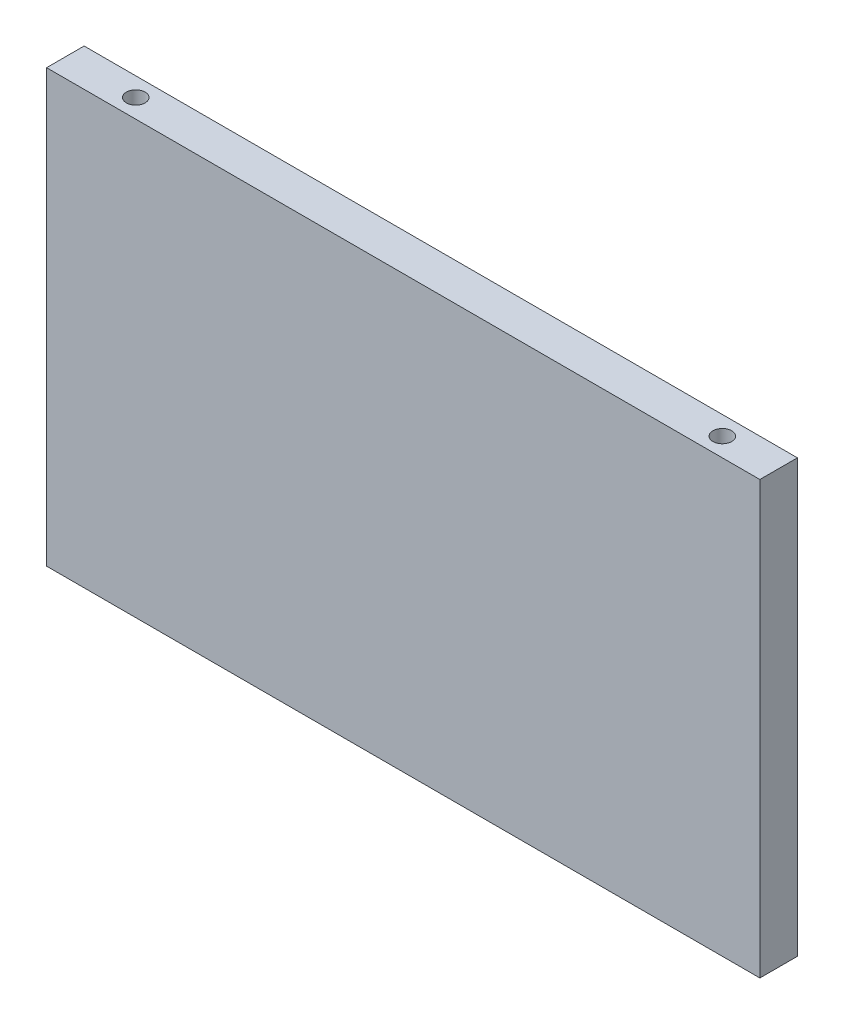
ISO-10303-21;
HEADER;
FILE_DESCRIPTION(('STEP AP214'),'2;1');
FILE_NAME('part.step','',(''),(''),'','','');
FILE_SCHEMA(('AUTOMOTIVE_DESIGN { 1 0 10303 214 1 1 1 1 }'));
ENDSEC;
DATA;
#1=APPLICATION_CONTEXT('core data for automotive mechanical design processes');
#2=APPLICATION_PROTOCOL_DEFINITION('international standard','automotive_design',2000,#1);
#3=PRODUCT_CONTEXT('',#1,'mechanical');
#4=PRODUCT('Part','Part','',(#3));
#5=PRODUCT_RELATED_PRODUCT_CATEGORY('part','',(#4));
#6=PRODUCT_DEFINITION_FORMATION('','',#4);
#7=PRODUCT_DEFINITION_CONTEXT('part definition',#1,'design');
#8=PRODUCT_DEFINITION('design','',#6,#7);
#9=PRODUCT_DEFINITION_SHAPE('','',#8);
#10=(LENGTH_UNIT() NAMED_UNIT(*) SI_UNIT(.MILLI.,.METRE.));
#11=(NAMED_UNIT(*) PLANE_ANGLE_UNIT() SI_UNIT($,.RADIAN.));
#12=(NAMED_UNIT(*) SI_UNIT($,.STERADIAN.) SOLID_ANGLE_UNIT());
#13=UNCERTAINTY_MEASURE_WITH_UNIT(LENGTH_MEASURE(1.E-05),#10,'distance_accuracy_value','');
#14=(GEOMETRIC_REPRESENTATION_CONTEXT(3) GLOBAL_UNCERTAINTY_ASSIGNED_CONTEXT((#13)) GLOBAL_UNIT_ASSIGNED_CONTEXT((#10,
#11,#12)) REPRESENTATION_CONTEXT('',''));
#15=CARTESIAN_POINT('',(0.,0.,0.));
#16=DIRECTION('',(0.,0.,1.));
#17=DIRECTION('',(1.,0.,0.));
#18=AXIS2_PLACEMENT_3D('',#15,#16,#17);
#19=CARTESIAN_POINT('',(-76.,-46.,8.));
#20=DIRECTION('',(1.,0.,0.));
#21=DIRECTION('',(0.,0.,-1.));
#22=AXIS2_PLACEMENT_3D('',#19,#20,#21);
#23=PLANE('',#22);
#24=DIRECTION('',(0.,-1.,0.));
#25=VECTOR('',#24,1.);
#26=CARTESIAN_POINT('',(-76.,-46.,0.));
#27=LINE('',#26,#25);
#28=CARTESIAN_POINT('',(-76.,46.,0.));
#29=VERTEX_POINT('',#28);
#30=CARTESIAN_POINT('',(-76.,-46.,0.));
#31=VERTEX_POINT('',#30);
#32=EDGE_CURVE('E96',#29,#31,#27,.T.);
#33=ORIENTED_EDGE('',*,*,#32,.T.);
#34=DIRECTION('',(0.,0.,-1.));
#35=VECTOR('',#34,1.);
#36=CARTESIAN_POINT('',(-76.,-46.,8.));
#37=LINE('',#36,#35);
#38=CARTESIAN_POINT('',(-76.,-46.,8.));
#39=VERTEX_POINT('',#38);
#40=EDGE_CURVE('E11',#39,#31,#37,.T.);
#41=ORIENTED_EDGE('',*,*,#40,.F.);
#42=DIRECTION('',(0.,-1.,0.));
#43=VECTOR('',#42,1.);
#44=CARTESIAN_POINT('',(-76.,-46.,8.));
#45=LINE('',#44,#43);
#46=CARTESIAN_POINT('',(-76.,46.,8.));
#47=VERTEX_POINT('',#46);
#48=EDGE_CURVE('E84',#47,#39,#45,.T.);
#49=ORIENTED_EDGE('',*,*,#48,.F.);
#50=DIRECTION('',(0.,0.,-1.));
#51=VECTOR('',#50,1.);
#52=CARTESIAN_POINT('',(-76.,46.,8.));
#53=LINE('',#52,#51);
#54=EDGE_CURVE('E92',#47,#29,#53,.T.);
#55=ORIENTED_EDGE('',*,*,#54,.T.);
#56=EDGE_LOOP('',(#33,#41,#49,#55));
#57=FACE_BOUND('',#56,.T.);
#58=ADVANCED_FACE('F33',(#57),#23,.F.);
#59=CARTESIAN_POINT('',(76.,-46.,8.));
#60=DIRECTION('',(0.,1.,0.));
#61=DIRECTION('',(-1.,0.,0.));
#62=AXIS2_PLACEMENT_3D('',#59,#60,#61);
#63=PLANE('',#62);
#64=CARTESIAN_POINT('',(64.,-46.,4.));
#65=DIRECTION('',(0.,-1.,0.));
#66=DIRECTION('',(1.,0.,0.));
#67=AXIS2_PLACEMENT_3D('',#64,#65,#66);
#68=CIRCLE('',#67,1.99999999999998);
#69=CARTESIAN_POINT('',(66.,-46.,4.));
#70=VERTEX_POINT('',#69);
#71=EDGE_CURVE('E116',#70,#70,#68,.T.);
#72=ORIENTED_EDGE('',*,*,#71,.F.);
#73=EDGE_LOOP('',(#72));
#74=FACE_BOUND('',#73,.T.);
#75=CARTESIAN_POINT('',(-61.,-46.,4.));
#76=DIRECTION('',(0.,-1.,0.));
#77=DIRECTION('',(1.,0.,0.));
#78=AXIS2_PLACEMENT_3D('',#75,#76,#77);
#79=CIRCLE('',#78,2.);
#80=CARTESIAN_POINT('',(-59.,-46.,4.));
#81=VERTEX_POINT('',#80);
#82=EDGE_CURVE('E110',#81,#81,#79,.T.);
#83=ORIENTED_EDGE('',*,*,#82,.F.);
#84=EDGE_LOOP('',(#83));
#85=FACE_BOUND('',#84,.T.);
#86=DIRECTION('',(1.,0.,0.));
#87=VECTOR('',#86,1.);
#88=CARTESIAN_POINT('',(76.,-46.,0.));
#89=LINE('',#88,#87);
#90=CARTESIAN_POINT('',(76.,-46.,0.));
#91=VERTEX_POINT('',#90);
#92=EDGE_CURVE('E88',#31,#91,#89,.T.);
#93=ORIENTED_EDGE('',*,*,#92,.T.);
#94=DIRECTION('',(0.,0.,-1.));
#95=VECTOR('',#94,1.);
#96=CARTESIAN_POINT('',(76.,-46.,8.));
#97=LINE('',#96,#95);
#98=CARTESIAN_POINT('',(76.,-46.,8.));
#99=VERTEX_POINT('',#98);
#100=EDGE_CURVE('E41',#99,#91,#97,.T.);
#101=ORIENTED_EDGE('',*,*,#100,.F.);
#102=DIRECTION('',(1.,0.,0.));
#103=VECTOR('',#102,1.);
#104=CARTESIAN_POINT('',(76.,-46.,8.));
#105=LINE('',#104,#103);
#106=EDGE_CURVE('E79',#39,#99,#105,.T.);
#107=ORIENTED_EDGE('',*,*,#106,.F.);
#108=ORIENTED_EDGE('',*,*,#40,.T.);
#109=EDGE_LOOP('',(#93,#101,#107,#108));
#110=FACE_BOUND('',#109,.T.);
#111=ADVANCED_FACE('F87',(#74,#85,#110),#63,.F.);
#112=CARTESIAN_POINT('',(76.,-46.,8.));
#113=DIRECTION('',(-1.,0.,0.));
#114=DIRECTION('',(0.,0.,1.));
#115=AXIS2_PLACEMENT_3D('',#112,#113,#114);
#116=PLANE('',#115);
#117=DIRECTION('',(0.,1.,0.));
#118=VECTOR('',#117,1.);
#119=CARTESIAN_POINT('',(76.,-46.,0.));
#120=LINE('',#119,#118);
#121=CARTESIAN_POINT('',(76.,46.,0.));
#122=VERTEX_POINT('',#121);
#123=EDGE_CURVE('E66',#91,#122,#120,.T.);
#124=ORIENTED_EDGE('',*,*,#123,.T.);
#125=DIRECTION('',(0.,0.,-1.));
#126=VECTOR('',#125,1.);
#127=CARTESIAN_POINT('',(76.,46.,8.));
#128=LINE('',#127,#126);
#129=CARTESIAN_POINT('',(76.,46.,8.));
#130=VERTEX_POINT('',#129);
#131=EDGE_CURVE('E89',#130,#122,#128,.T.);
#132=ORIENTED_EDGE('',*,*,#131,.F.);
#133=DIRECTION('',(0.,1.,0.));
#134=VECTOR('',#133,1.);
#135=CARTESIAN_POINT('',(76.,-46.,8.));
#136=LINE('',#135,#134);
#137=EDGE_CURVE('E82',#99,#130,#136,.T.);
#138=ORIENTED_EDGE('',*,*,#137,.F.);
#139=ORIENTED_EDGE('',*,*,#100,.T.);
#140=EDGE_LOOP('',(#124,#132,#138,#139));
#141=FACE_BOUND('',#140,.T.);
#142=ADVANCED_FACE('F90',(#141),#116,.F.);
#143=CARTESIAN_POINT('',(76.,46.,8.));
#144=DIRECTION('',(0.,-1.,0.));
#145=DIRECTION('',(1.,0.,0.));
#146=AXIS2_PLACEMENT_3D('',#143,#144,#145);
#147=PLANE('',#146);
#148=CARTESIAN_POINT('',(64.,46.,4.));
#149=DIRECTION('',(0.,-1.,0.));
#150=DIRECTION('',(1.,0.,0.));
#151=AXIS2_PLACEMENT_3D('',#148,#149,#150);
#152=CIRCLE('',#151,1.99999999999998);
#153=CARTESIAN_POINT('',(66.,46.,4.));
#154=VERTEX_POINT('',#153);
#155=EDGE_CURVE('E99',#154,#154,#152,.T.);
#156=ORIENTED_EDGE('',*,*,#155,.T.);
#157=EDGE_LOOP('',(#156));
#158=FACE_BOUND('',#157,.T.);
#159=CARTESIAN_POINT('',(-61.,46.,4.));
#160=DIRECTION('',(0.,-1.,0.));
#161=DIRECTION('',(1.,0.,0.));
#162=AXIS2_PLACEMENT_3D('',#159,#160,#161);
#163=CIRCLE('',#162,2.);
#164=CARTESIAN_POINT('',(-59.,46.,4.));
#165=VERTEX_POINT('',#164);
#166=EDGE_CURVE('E113',#165,#165,#163,.T.);
#167=ORIENTED_EDGE('',*,*,#166,.T.);
#168=EDGE_LOOP('',(#167));
#169=FACE_BOUND('',#168,.T.);
#170=DIRECTION('',(-1.,0.,0.));
#171=VECTOR('',#170,1.);
#172=CARTESIAN_POINT('',(76.,46.,0.));
#173=LINE('',#172,#171);
#174=EDGE_CURVE('E72',#122,#29,#173,.T.);
#175=ORIENTED_EDGE('',*,*,#174,.T.);
#176=ORIENTED_EDGE('',*,*,#54,.F.);
#177=DIRECTION('',(-1.,0.,0.));
#178=VECTOR('',#177,1.);
#179=CARTESIAN_POINT('',(76.,46.,8.));
#180=LINE('',#179,#178);
#181=EDGE_CURVE('E49',#130,#47,#180,.T.);
#182=ORIENTED_EDGE('',*,*,#181,.F.);
#183=ORIENTED_EDGE('',*,*,#131,.T.);
#184=EDGE_LOOP('',(#175,#176,#182,#183));
#185=FACE_BOUND('',#184,.T.);
#186=ADVANCED_FACE('F104',(#158,#169,#185),#147,.F.);
#187=CARTESIAN_POINT('',(0.,0.,8.));
#188=DIRECTION('',(0.,0.,1.));
#189=DIRECTION('',(1.,0.,0.));
#190=AXIS2_PLACEMENT_3D('',#187,#188,#189);
#191=PLANE('',#190);
#192=ORIENTED_EDGE('',*,*,#48,.T.);
#193=ORIENTED_EDGE('',*,*,#106,.T.);
#194=ORIENTED_EDGE('',*,*,#137,.T.);
#195=ORIENTED_EDGE('',*,*,#181,.T.);
#196=EDGE_LOOP('',(#192,#193,#194,#195));
#197=FACE_BOUND('',#196,.T.);
#198=ADVANCED_FACE('F80',(#197),#191,.T.);
#199=CARTESIAN_POINT('',(0.,0.,0.));
#200=DIRECTION('',(0.,0.,1.));
#201=DIRECTION('',(1.,0.,0.));
#202=AXIS2_PLACEMENT_3D('',#199,#200,#201);
#203=PLANE('',#202);
#204=ORIENTED_EDGE('',*,*,#32,.F.);
#205=ORIENTED_EDGE('',*,*,#174,.F.);
#206=ORIENTED_EDGE('',*,*,#123,.F.);
#207=ORIENTED_EDGE('',*,*,#92,.F.);
#208=EDGE_LOOP('',(#204,#205,#206,#207));
#209=FACE_BOUND('',#208,.T.);
#210=ADVANCED_FACE('F107',(#209),#203,.F.);
#211=CARTESIAN_POINT('',(-61.,46.,4.));
#212=DIRECTION('',(0.,-1.,0.));
#213=DIRECTION('',(1.,0.,0.));
#214=AXIS2_PLACEMENT_3D('',#211,#212,#213);
#215=CYLINDRICAL_SURFACE('',#214,2.);
#216=ORIENTED_EDGE('',*,*,#166,.F.);
#217=EDGE_LOOP('',(#216));
#218=FACE_BOUND('',#217,.T.);
#219=ORIENTED_EDGE('',*,*,#82,.T.);
#220=EDGE_LOOP('',(#219));
#221=FACE_BOUND('',#220,.T.);
#222=ADVANCED_FACE('F127',(#218,#221),#215,.F.);
#223=CARTESIAN_POINT('',(64.,46.,4.));
#224=DIRECTION('',(0.,-1.,0.));
#225=DIRECTION('',(1.,0.,0.));
#226=AXIS2_PLACEMENT_3D('',#223,#224,#225);
#227=CYLINDRICAL_SURFACE('',#226,1.99999999999998);
#228=ORIENTED_EDGE('',*,*,#155,.F.);
#229=EDGE_LOOP('',(#228));
#230=FACE_BOUND('',#229,.T.);
#231=ORIENTED_EDGE('',*,*,#71,.T.);
#232=EDGE_LOOP('',(#231));
#233=FACE_BOUND('',#232,.T.);
#234=ADVANCED_FACE('F124',(#230,#233),#227,.F.);
#235=CLOSED_SHELL('',(#58,#111,#142,#186,#198,#210,#222,#234));
#236=MANIFOLD_SOLID_BREP('B2',#235);
#237=ADVANCED_BREP_SHAPE_REPRESENTATION('',(#18,#236),#14);
#238=SHAPE_DEFINITION_REPRESENTATION(#9,#237);
ENDSEC;
END-ISO-10303-21;
